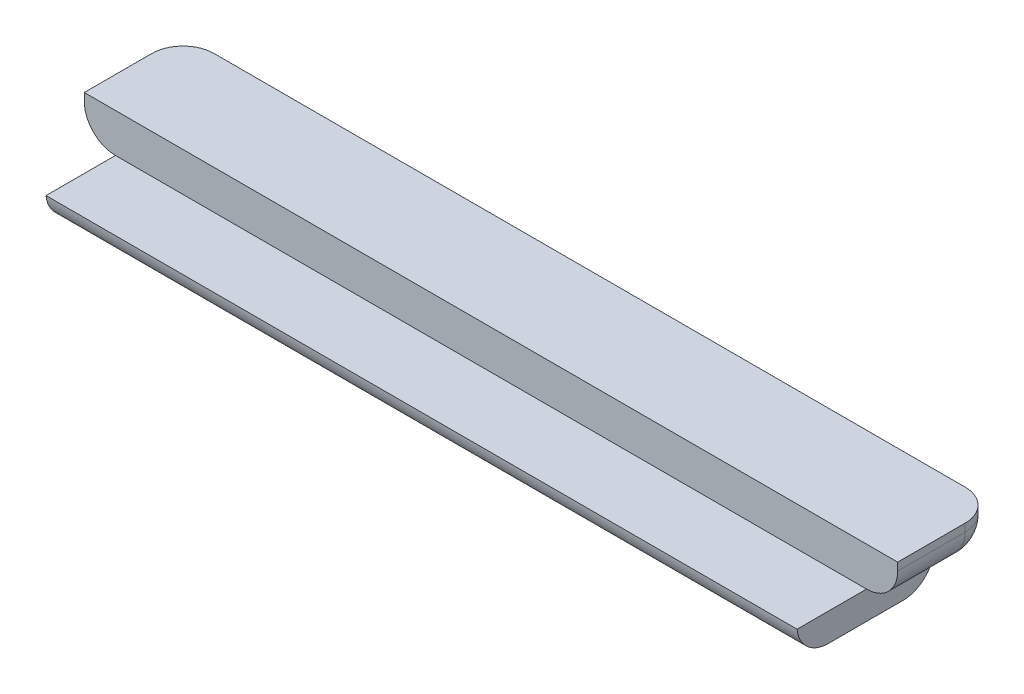
ISO-10303-21;
HEADER;
FILE_DESCRIPTION(('STEP AP214'),'2;1');
FILE_NAME('part.step','',(''),(''),'','','');
FILE_SCHEMA(('AUTOMOTIVE_DESIGN { 1 0 10303 214 1 1 1 1 }'));
ENDSEC;
DATA;
#1=APPLICATION_CONTEXT('core data for automotive mechanical design processes');
#2=APPLICATION_PROTOCOL_DEFINITION('international standard','automotive_design',2000,#1);
#3=PRODUCT_CONTEXT('',#1,'mechanical');
#4=PRODUCT('Part','Part','',(#3));
#5=PRODUCT_RELATED_PRODUCT_CATEGORY('part','',(#4));
#6=PRODUCT_DEFINITION_FORMATION('','',#4);
#7=PRODUCT_DEFINITION_CONTEXT('part definition',#1,'design');
#8=PRODUCT_DEFINITION('design','',#6,#7);
#9=PRODUCT_DEFINITION_SHAPE('','',#8);
#10=(LENGTH_UNIT() NAMED_UNIT(*) SI_UNIT(.MILLI.,.METRE.));
#11=(NAMED_UNIT(*) PLANE_ANGLE_UNIT() SI_UNIT($,.RADIAN.));
#12=(NAMED_UNIT(*) SI_UNIT($,.STERADIAN.) SOLID_ANGLE_UNIT());
#13=UNCERTAINTY_MEASURE_WITH_UNIT(LENGTH_MEASURE(1.E-05),#10,'distance_accuracy_value','');
#14=(GEOMETRIC_REPRESENTATION_CONTEXT(3) GLOBAL_UNCERTAINTY_ASSIGNED_CONTEXT((#13)) GLOBAL_UNIT_ASSIGNED_CONTEXT((#10,
#11,#12)) REPRESENTATION_CONTEXT('',''));
#15=CARTESIAN_POINT('',(0.,0.,0.));
#16=DIRECTION('',(0.,0.,1.));
#17=DIRECTION('',(1.,0.,0.));
#18=AXIS2_PLACEMENT_3D('',#15,#16,#17);
#19=CARTESIAN_POINT('',(84.197935513334,-35.5,-38.3185461088218));
#20=DIRECTION('',(0.,0.,1.));
#21=DIRECTION('',(1.,0.,0.));
#22=AXIS2_PLACEMENT_3D('',#19,#20,#21);
#23=CYLINDRICAL_SURFACE('',#22,2.);
#24=CARTESIAN_POINT('',(84.197935513334,-35.5,-31.9863937245133));
#25=DIRECTION('',(0.,0.,1.));
#26=DIRECTION('',(1.,0.,0.));
#27=AXIS2_PLACEMENT_3D('',#24,#25,#26);
#28=CIRCLE('',#27,2.);
#29=CARTESIAN_POINT('',(84.1991109932734,-37.4999996545617,-31.9863937245133));
#30=VERTEX_POINT('',#29);
#31=CARTESIAN_POINT('',(86.197935513334,-35.5,-31.9863937245133));
#32=VERTEX_POINT('',#31);
#33=EDGE_CURVE('E187',#30,#32,#28,.T.);
#34=ORIENTED_EDGE('',*,*,#33,.F.);
#35=DIRECTION('',(0.,0.,1.));
#36=VECTOR('',#35,1.);
#37=CARTESIAN_POINT('',(84.1991109932734,-37.5,-36.3185461088218));
#38=LINE('',#37,#36);
#39=CARTESIAN_POINT('',(84.1991109930703,-37.4999996545618,-36.3185461088218));
#40=VERTEX_POINT('',#39);
#41=EDGE_CURVE('E226',#40,#30,#38,.T.);
#42=ORIENTED_EDGE('',*,*,#41,.F.);
#43=CARTESIAN_POINT('',(84.197935513334,-35.5,-36.3185461088218));
#44=DIRECTION('',(0.,0.,-1.));
#45=DIRECTION('',(-1.,0.,0.));
#46=AXIS2_PLACEMENT_3D('',#43,#44,#45);
#47=CIRCLE('',#46,2.);
#48=CARTESIAN_POINT('',(86.197935513334,-35.5,-36.3185461088218));
#49=VERTEX_POINT('',#48);
#50=EDGE_CURVE('E179',#49,#40,#47,.T.);
#51=ORIENTED_EDGE('',*,*,#50,.F.);
#52=DIRECTION('',(0.,0.,-1.));
#53=VECTOR('',#52,1.);
#54=CARTESIAN_POINT('',(86.197935513334,-35.5,-36.3185461088218));
#55=LINE('',#54,#53);
#56=EDGE_CURVE('E153',#32,#49,#55,.T.);
#57=ORIENTED_EDGE('',*,*,#56,.F.);
#58=EDGE_LOOP('',(#34,#42,#51,#57));
#59=FACE_BOUND('',#58,.T.);
#60=ADVANCED_FACE('F35',(#59),#23,.T.);
#61=CARTESIAN_POINT('',(33.9976879154478,-37.5,-38.3185461088218));
#62=DIRECTION('',(-1.,0.,0.));
#63=DIRECTION('',(0.,0.,1.));
#64=AXIS2_PLACEMENT_3D('',#61,#62,#63);
#65=PLANE('',#64);
#66=DIRECTION('',(0.,0.,1.));
#67=VECTOR('',#66,1.);
#68=CARTESIAN_POINT('',(33.9976879154478,-35.,-38.3185461088218));
#69=LINE('',#68,#67);
#70=CARTESIAN_POINT('',(33.9976879154478,-35.,-36.3185461088218));
#71=VERTEX_POINT('',#70);
#72=CARTESIAN_POINT('',(33.9976879154478,-35.,-31.9863937245133));
#73=VERTEX_POINT('',#72);
#74=EDGE_CURVE('E182',#71,#73,#69,.T.);
#75=ORIENTED_EDGE('',*,*,#74,.F.);
#76=DIRECTION('',(0.,1.,0.));
#77=VECTOR('',#76,1.);
#78=CARTESIAN_POINT('',(33.9976879154478,-37.5,-36.3185461088218));
#79=LINE('',#78,#77);
#80=CARTESIAN_POINT('',(33.9976879154478,-35.5,-36.3185461088218));
#81=VERTEX_POINT('',#80);
#82=EDGE_CURVE('E161',#71,#81,#79,.F.);
#83=ORIENTED_EDGE('',*,*,#82,.T.);
#84=DIRECTION('',(0.,0.,1.));
#85=VECTOR('',#84,1.);
#86=CARTESIAN_POINT('',(33.9976879154478,-35.5,-31.9863937245133));
#87=LINE('',#86,#85);
#88=CARTESIAN_POINT('',(33.9976879154478,-35.5,-31.9863937245133));
#89=VERTEX_POINT('',#88);
#90=EDGE_CURVE('E145',#81,#89,#87,.T.);
#91=ORIENTED_EDGE('',*,*,#90,.T.);
#92=DIRECTION('',(0.,1.,0.));
#93=VECTOR('',#92,1.);
#94=CARTESIAN_POINT('',(33.9976879154478,-37.5,-31.9863937245133));
#95=LINE('',#94,#93);
#96=EDGE_CURVE('E206',#89,#73,#95,.T.);
#97=ORIENTED_EDGE('',*,*,#96,.T.);
#98=EDGE_LOOP('',(#75,#83,#91,#97));
#99=FACE_BOUND('',#98,.T.);
#100=ADVANCED_FACE('F254',(#99),#65,.T.);
#101=CARTESIAN_POINT('',(33.9976879154478,-37.5,-38.3185461088218));
#102=DIRECTION('',(0.,0.,-1.));
#103=DIRECTION('',(-1.,0.,0.));
#104=AXIS2_PLACEMENT_3D('',#101,#102,#103);
#105=PLANE('',#104);
#106=DIRECTION('',(-1.,0.,0.));
#107=VECTOR('',#106,1.);
#108=CARTESIAN_POINT('',(33.9976879154478,-35.,-38.3185461088218));
#109=LINE('',#108,#107);
#110=CARTESIAN_POINT('',(84.197935513334,-35.,-38.3185461088218));
#111=VERTEX_POINT('',#110);
#112=CARTESIAN_POINT('',(35.9976879154478,-35.,-38.3185461088218));
#113=VERTEX_POINT('',#112);
#114=EDGE_CURVE('E210',#111,#113,#109,.T.);
#115=ORIENTED_EDGE('',*,*,#114,.F.);
#116=DIRECTION('',(0.,1.,0.));
#117=VECTOR('',#116,1.);
#118=CARTESIAN_POINT('',(84.197935513334,-37.5,-38.3185461088218));
#119=LINE('',#118,#117);
#120=CARTESIAN_POINT('',(84.197935513334,-35.5,-38.3185461088218));
#121=VERTEX_POINT('',#120);
#122=EDGE_CURVE('E136',#111,#121,#119,.F.);
#123=ORIENTED_EDGE('',*,*,#122,.T.);
#124=DIRECTION('',(-1.,0.,0.));
#125=VECTOR('',#124,1.);
#126=CARTESIAN_POINT('',(33.9976879154478,-35.5,-38.3185461088218));
#127=LINE('',#126,#125);
#128=CARTESIAN_POINT('',(35.9976879154478,-35.5,-38.3185461088218));
#129=VERTEX_POINT('',#128);
#130=EDGE_CURVE('E154',#121,#129,#127,.T.);
#131=ORIENTED_EDGE('',*,*,#130,.T.);
#132=DIRECTION('',(0.,1.,0.));
#133=VECTOR('',#132,1.);
#134=CARTESIAN_POINT('',(35.9976879154478,-37.5,-38.3185461088218));
#135=LINE('',#134,#133);
#136=EDGE_CURVE('E193',#129,#113,#135,.T.);
#137=ORIENTED_EDGE('',*,*,#136,.T.);
#138=EDGE_LOOP('',(#115,#123,#131,#137));
#139=FACE_BOUND('',#138,.T.);
#140=ADVANCED_FACE('F262',(#139),#105,.T.);
#141=CARTESIAN_POINT('',(86.197935513334,-37.5,-38.3185461088218));
#142=DIRECTION('',(1.,0.,0.));
#143=DIRECTION('',(0.,0.,-1.));
#144=AXIS2_PLACEMENT_3D('',#141,#142,#143);
#145=PLANE('',#144);
#146=ORIENTED_EDGE('',*,*,#56,.T.);
#147=DIRECTION('',(0.,1.,0.));
#148=VECTOR('',#147,1.);
#149=CARTESIAN_POINT('',(86.197935513334,-37.5,-36.3185461088218));
#150=LINE('',#149,#148);
#151=CARTESIAN_POINT('',(86.197935513334,-35.,-36.3185461088218));
#152=VERTEX_POINT('',#151);
#153=EDGE_CURVE('E200',#49,#152,#150,.T.);
#154=ORIENTED_EDGE('',*,*,#153,.T.);
#155=DIRECTION('',(0.,0.,-1.));
#156=VECTOR('',#155,1.);
#157=CARTESIAN_POINT('',(86.197935513334,-35.,-38.3185461088218));
#158=LINE('',#157,#156);
#159=CARTESIAN_POINT('',(86.197935513334,-35.,-31.9863937245133));
#160=VERTEX_POINT('',#159);
#161=EDGE_CURVE('E213',#160,#152,#158,.T.);
#162=ORIENTED_EDGE('',*,*,#161,.F.);
#163=DIRECTION('',(0.,1.,0.));
#164=VECTOR('',#163,1.);
#165=CARTESIAN_POINT('',(86.197935513334,-37.5,-31.9863937245133));
#166=LINE('',#165,#164);
#167=EDGE_CURVE('E205',#32,#160,#166,.T.);
#168=ORIENTED_EDGE('',*,*,#167,.F.);
#169=EDGE_LOOP('',(#146,#154,#162,#168));
#170=FACE_BOUND('',#169,.T.);
#171=ADVANCED_FACE('F272',(#170),#145,.T.);
#172=CARTESIAN_POINT('',(33.9976879154478,-37.5,-31.9863937245133));
#173=DIRECTION('',(0.,0.,1.));
#174=DIRECTION('',(1.,0.,0.));
#175=AXIS2_PLACEMENT_3D('',#172,#173,#174);
#176=PLANE('',#175);
#177=DIRECTION('',(1.,0.,0.));
#178=VECTOR('',#177,1.);
#179=CARTESIAN_POINT('',(33.9976879154478,-37.5,-31.9863937245133));
#180=LINE('',#179,#178);
#181=CARTESIAN_POINT('',(35.9976879154478,-37.5,-31.9863937245133));
#182=VERTEX_POINT('',#181);
#183=CARTESIAN_POINT('',(84.197935513334,-37.5,-31.9863937245133));
#184=VERTEX_POINT('',#183);
#185=EDGE_CURVE('E208',#182,#184,#180,.T.);
#186=ORIENTED_EDGE('',*,*,#185,.T.);
#187=EDGE_CURVE('E175',#184,#30,#28,.T.);
#188=ORIENTED_EDGE('',*,*,#187,.T.);
#189=ORIENTED_EDGE('',*,*,#33,.T.);
#190=ORIENTED_EDGE('',*,*,#167,.T.);
#191=DIRECTION('',(1.,0.,0.));
#192=VECTOR('',#191,1.);
#193=CARTESIAN_POINT('',(33.9976879154478,-35.,-31.9863937245133));
#194=LINE('',#193,#192);
#195=EDGE_CURVE('E216',#73,#160,#194,.T.);
#196=ORIENTED_EDGE('',*,*,#195,.F.);
#197=ORIENTED_EDGE('',*,*,#96,.F.);
#198=CARTESIAN_POINT('',(35.9976879154478,-35.5,-31.9863937245133));
#199=DIRECTION('',(0.,0.,1.));
#200=DIRECTION('',(1.,0.,0.));
#201=AXIS2_PLACEMENT_3D('',#198,#199,#200);
#202=CIRCLE('',#201,2.);
#203=EDGE_CURVE('E160',#89,#182,#202,.T.);
#204=ORIENTED_EDGE('',*,*,#203,.T.);
#205=EDGE_LOOP('',(#186,#188,#189,#190,#196,#197,#204));
#206=FACE_BOUND('',#205,.T.);
#207=ADVANCED_FACE('F248',(#206),#176,.T.);
#208=CARTESIAN_POINT('',(0.,-35.,0.));
#209=DIRECTION('',(0.,1.,0.));
#210=DIRECTION('',(0.,0.,1.));
#211=AXIS2_PLACEMENT_3D('',#208,#209,#210);
#212=PLANE('',#211);
#213=ORIENTED_EDGE('',*,*,#161,.T.);
#214=CARTESIAN_POINT('',(84.197935513334,-35.,-36.3185461088218));
#215=DIRECTION('',(0.,1.,0.));
#216=DIRECTION('',(0.,0.,1.));
#217=AXIS2_PLACEMENT_3D('',#214,#215,#216);
#218=CIRCLE('',#217,2.);
#219=EDGE_CURVE('E196',#152,#111,#218,.T.);
#220=ORIENTED_EDGE('',*,*,#219,.T.);
#221=ORIENTED_EDGE('',*,*,#114,.T.);
#222=CARTESIAN_POINT('',(35.9976879154478,-35.,-36.3185461088218));
#223=DIRECTION('',(0.,1.,0.));
#224=DIRECTION('',(0.,0.,1.));
#225=AXIS2_PLACEMENT_3D('',#222,#223,#224);
#226=CIRCLE('',#225,2.);
#227=EDGE_CURVE('E198',#113,#71,#226,.T.);
#228=ORIENTED_EDGE('',*,*,#227,.T.);
#229=ORIENTED_EDGE('',*,*,#74,.T.);
#230=ORIENTED_EDGE('',*,*,#195,.T.);
#231=EDGE_LOOP('',(#213,#220,#221,#228,#229,#230));
#232=FACE_BOUND('',#231,.T.);
#233=ADVANCED_FACE('F257',(#232),#212,.T.);
#234=CARTESIAN_POINT('',(33.9976879154478,-35.5,-36.3185461088218));
#235=DIRECTION('',(1.,0.,0.));
#236=DIRECTION('',(0.,0.,-1.));
#237=AXIS2_PLACEMENT_3D('',#234,#235,#236);
#238=CYLINDRICAL_SURFACE('',#237,2.);
#239=ORIENTED_EDGE('',*,*,#130,.F.);
#240=CARTESIAN_POINT('',(84.197935513334,-35.5,-36.3185461088218));
#241=DIRECTION('',(1.,0.,0.));
#242=DIRECTION('',(0.,0.,-1.));
#243=AXIS2_PLACEMENT_3D('',#240,#241,#242);
#244=CIRCLE('',#243,2.);
#245=CARTESIAN_POINT('',(84.197935513334,-37.5,-36.3185461088218));
#246=VERTEX_POINT('',#245);
#247=EDGE_CURVE('E135',#121,#246,#244,.F.);
#248=ORIENTED_EDGE('',*,*,#247,.T.);
#249=DIRECTION('',(-1.,0.,0.));
#250=VECTOR('',#249,1.);
#251=CARTESIAN_POINT('',(86.197935513334,-37.5,-36.3185461088218));
#252=LINE('',#251,#250);
#253=CARTESIAN_POINT('',(35.9976879154478,-37.5,-36.3185461088218));
#254=VERTEX_POINT('',#253);
#255=EDGE_CURVE('E150',#254,#246,#252,.F.);
#256=ORIENTED_EDGE('',*,*,#255,.F.);
#257=CARTESIAN_POINT('',(35.9976879154478,-35.5,-36.3185461088218));
#258=DIRECTION('',(1.,0.,0.));
#259=DIRECTION('',(0.,0.,-1.));
#260=AXIS2_PLACEMENT_3D('',#257,#258,#259);
#261=CIRCLE('',#260,2.);
#262=EDGE_CURVE('E124',#254,#129,#261,.T.);
#263=ORIENTED_EDGE('',*,*,#262,.T.);
#264=EDGE_LOOP('',(#239,#248,#256,#263));
#265=FACE_BOUND('',#264,.T.);
#266=ADVANCED_FACE('F151',(#265),#238,.T.);
#267=CARTESIAN_POINT('',(84.197935513334,-35.5,-36.3185461088218));
#268=DIRECTION('',(1.,0.,0.));
#269=DIRECTION('',(0.,0.,-1.));
#270=AXIS2_PLACEMENT_3D('',#267,#268,#269);
#271=SPHERICAL_SURFACE('',#270,2.);
#272=ORIENTED_EDGE('',*,*,#50,.T.);
#273=DIRECTION('',(1.,0.,0.));
#274=VECTOR('',#273,1.);
#275=CARTESIAN_POINT('',(35.9976879154478,-37.5,-36.3185461088218));
#276=LINE('',#275,#274);
#277=EDGE_CURVE('E230',#246,#40,#276,.T.);
#278=ORIENTED_EDGE('',*,*,#277,.F.);
#279=ORIENTED_EDGE('',*,*,#247,.F.);
#280=CARTESIAN_POINT('',(84.197935513334,-35.5,-36.3185461088218));
#281=DIRECTION('',(0.,1.,0.));
#282=DIRECTION('',(0.,0.,1.));
#283=AXIS2_PLACEMENT_3D('',#280,#281,#282);
#284=CIRCLE('',#283,2.);
#285=EDGE_CURVE('E146',#49,#121,#284,.T.);
#286=ORIENTED_EDGE('',*,*,#285,.F.);
#287=EDGE_LOOP('',(#272,#278,#279,#286));
#288=FACE_BOUND('',#287,.T.);
#289=ADVANCED_FACE('F266',(#288),#271,.T.);
#290=CARTESIAN_POINT('',(84.197935513334,-37.5,-36.3185461088218));
#291=DIRECTION('',(0.,1.,0.));
#292=DIRECTION('',(0.,0.,1.));
#293=AXIS2_PLACEMENT_3D('',#290,#291,#292);
#294=CYLINDRICAL_SURFACE('',#293,2.);
#295=ORIENTED_EDGE('',*,*,#285,.T.);
#296=ORIENTED_EDGE('',*,*,#122,.F.);
#297=ORIENTED_EDGE('',*,*,#219,.F.);
#298=ORIENTED_EDGE('',*,*,#153,.F.);
#299=EDGE_LOOP('',(#295,#296,#297,#298));
#300=FACE_BOUND('',#299,.T.);
#301=ADVANCED_FACE('F269',(#300),#294,.T.);
#302=CARTESIAN_POINT('',(35.9976879154478,-35.5,-38.3185461088218));
#303=DIRECTION('',(0.,0.,-1.));
#304=DIRECTION('',(-1.,0.,0.));
#305=AXIS2_PLACEMENT_3D('',#302,#303,#304);
#306=CYLINDRICAL_SURFACE('',#305,2.);
#307=CARTESIAN_POINT('',(35.9976879154478,-35.5,-36.3185461088218));
#308=DIRECTION('',(0.,0.,-1.));
#309=DIRECTION('',(-1.,0.,0.));
#310=AXIS2_PLACEMENT_3D('',#307,#308,#309);
#311=CIRCLE('',#310,2.);
#312=EDGE_CURVE('E127',#254,#81,#311,.T.);
#313=ORIENTED_EDGE('',*,*,#312,.F.);
#314=DIRECTION('',(0.,0.,1.));
#315=VECTOR('',#314,1.);
#316=CARTESIAN_POINT('',(35.9976879154478,-37.5,-36.3185461088218));
#317=LINE('',#316,#315);
#318=EDGE_CURVE('E143',#182,#254,#317,.F.);
#319=ORIENTED_EDGE('',*,*,#318,.F.);
#320=ORIENTED_EDGE('',*,*,#203,.F.);
#321=ORIENTED_EDGE('',*,*,#90,.F.);
#322=EDGE_LOOP('',(#313,#319,#320,#321));
#323=FACE_BOUND('',#322,.T.);
#324=ADVANCED_FACE('F141',(#323),#306,.T.);
#325=CARTESIAN_POINT('',(35.9976879154478,-35.5,-36.3185461088218));
#326=DIRECTION('',(-1.,0.,0.));
#327=DIRECTION('',(0.,0.,1.));
#328=AXIS2_PLACEMENT_3D('',#325,#326,#327);
#329=SPHERICAL_SURFACE('',#328,2.);
#330=ORIENTED_EDGE('',*,*,#262,.F.);
#331=ORIENTED_EDGE('',*,*,#312,.T.);
#332=CARTESIAN_POINT('',(35.9976879154478,-35.5,-36.3185461088218));
#333=DIRECTION('',(0.,1.,0.));
#334=DIRECTION('',(0.,0.,1.));
#335=AXIS2_PLACEMENT_3D('',#332,#333,#334);
#336=CIRCLE('',#335,2.);
#337=EDGE_CURVE('E129',#129,#81,#336,.T.);
#338=ORIENTED_EDGE('',*,*,#337,.F.);
#339=EDGE_LOOP('',(#330,#331,#338));
#340=FACE_BOUND('',#339,.T.);
#341=ADVANCED_FACE('F126',(#340),#329,.T.);
#342=CARTESIAN_POINT('',(35.9976879154478,-37.5,-36.3185461088218));
#343=DIRECTION('',(0.,1.,0.));
#344=DIRECTION('',(0.,0.,1.));
#345=AXIS2_PLACEMENT_3D('',#342,#343,#344);
#346=CYLINDRICAL_SURFACE('',#345,2.);
#347=ORIENTED_EDGE('',*,*,#337,.T.);
#348=ORIENTED_EDGE('',*,*,#82,.F.);
#349=ORIENTED_EDGE('',*,*,#227,.F.);
#350=ORIENTED_EDGE('',*,*,#136,.F.);
#351=EDGE_LOOP('',(#347,#348,#349,#350));
#352=FACE_BOUND('',#351,.T.);
#353=ADVANCED_FACE('F260',(#352),#346,.T.);
#354=CARTESIAN_POINT('',(0.,-37.5,0.));
#355=DIRECTION('',(0.,1.,0.));
#356=DIRECTION('',(0.,0.,1.));
#357=AXIS2_PLACEMENT_3D('',#354,#355,#356);
#358=PLANE('',#357);
#359=ORIENTED_EDGE('',*,*,#187,.F.);
#360=ORIENTED_EDGE('',*,*,#185,.F.);
#361=DIRECTION('',(0.,0.,-1.));
#362=VECTOR('',#361,1.);
#363=CARTESIAN_POINT('',(35.9976879154478,-37.5,-36.3185461088218));
#364=LINE('',#363,#362);
#365=CARTESIAN_POINT('',(35.9976879154478,-37.5,-27.5295198989113));
#366=VERTEX_POINT('',#365);
#367=EDGE_CURVE('E159',#366,#182,#364,.T.);
#368=ORIENTED_EDGE('',*,*,#367,.F.);
#369=DIRECTION('',(-1.,0.,0.));
#370=VECTOR('',#369,1.);
#371=CARTESIAN_POINT('',(35.9976879154478,-37.5,-27.5295198989113));
#372=LINE('',#371,#370);
#373=CARTESIAN_POINT('',(84.1991109932734,-37.5,-27.5295198989113));
#374=VERTEX_POINT('',#373);
#375=EDGE_CURVE('E222',#374,#366,#372,.T.);
#376=ORIENTED_EDGE('',*,*,#375,.F.);
#377=EDGE_CURVE('E229',#30,#374,#38,.T.);
#378=ORIENTED_EDGE('',*,*,#377,.F.);
#379=EDGE_LOOP('',(#359,#360,#368,#376,#378));
#380=FACE_BOUND('',#379,.T.);
#381=ADVANCED_FACE('F240',(#380),#358,.T.);
#382=CARTESIAN_POINT('',(35.9976879154478,-39.3,-36.3185461088218));
#383=DIRECTION('',(1.,0.,0.));
#384=DIRECTION('',(0.,0.,-1.));
#385=AXIS2_PLACEMENT_3D('',#382,#383,#384);
#386=PLANE('',#385);
#387=ORIENTED_EDGE('',*,*,#318,.T.);
#388=CARTESIAN_POINT('',(35.9976879154478,-37.3,-34.3285712346085));
#389=DIRECTION('',(1.,0.,0.));
#390=DIRECTION('',(0.,0.,-1.));
#391=AXIS2_PLACEMENT_3D('',#388,#389,#390);
#392=CIRCLE('',#391,2.);
#393=CARTESIAN_POINT('',(35.9976879154478,-39.3,-34.3285712346085));
#394=VERTEX_POINT('',#393);
#395=EDGE_CURVE('E11',#254,#394,#392,.F.);
#396=ORIENTED_EDGE('',*,*,#395,.T.);
#397=DIRECTION('',(0.,0.,-1.));
#398=VECTOR('',#397,1.);
#399=CARTESIAN_POINT('',(35.9976879154478,-39.3,-36.3185461088218));
#400=LINE('',#399,#398);
#401=CARTESIAN_POINT('',(35.9976879154478,-39.3,-29.5194947731245));
#402=VERTEX_POINT('',#401);
#403=EDGE_CURVE('E225',#402,#394,#400,.T.);
#404=ORIENTED_EDGE('',*,*,#403,.F.);
#405=CARTESIAN_POINT('',(35.9976879154478,-37.3,-29.5194947731245));
#406=DIRECTION('',(1.,0.,0.));
#407=DIRECTION('',(0.,0.,-1.));
#408=AXIS2_PLACEMENT_3D('',#405,#406,#407);
#409=CIRCLE('',#408,2.);
#410=EDGE_CURVE('E169',#402,#366,#409,.F.);
#411=ORIENTED_EDGE('',*,*,#410,.T.);
#412=ORIENTED_EDGE('',*,*,#367,.T.);
#413=EDGE_LOOP('',(#387,#396,#404,#411,#412));
#414=FACE_BOUND('',#413,.T.);
#415=ADVANCED_FACE('F157',(#414),#386,.F.);
#416=CARTESIAN_POINT('',(84.1991109932734,-39.3,-36.3185461088218));
#417=DIRECTION('',(-1.,0.,0.));
#418=DIRECTION('',(0.,0.,1.));
#419=AXIS2_PLACEMENT_3D('',#416,#417,#418);
#420=PLANE('',#419);
#421=DIRECTION('',(0.,0.,1.));
#422=VECTOR('',#421,1.);
#423=CARTESIAN_POINT('',(84.1991109932734,-39.3,-36.3185461088218));
#424=LINE('',#423,#422);
#425=CARTESIAN_POINT('',(84.1991109932734,-39.3,-34.3285712346085));
#426=VERTEX_POINT('',#425);
#427=CARTESIAN_POINT('',(84.1991109932734,-39.3,-29.5194947731245));
#428=VERTEX_POINT('',#427);
#429=EDGE_CURVE('E178',#426,#428,#424,.T.);
#430=ORIENTED_EDGE('',*,*,#429,.F.);
#431=CARTESIAN_POINT('',(84.1991109932734,-37.3,-34.3285712346085));
#432=DIRECTION('',(-1.,0.,0.));
#433=DIRECTION('',(0.,0.,1.));
#434=AXIS2_PLACEMENT_3D('',#431,#432,#433);
#435=CIRCLE('',#434,2.);
#436=EDGE_CURVE('E43',#426,#40,#435,.F.);
#437=ORIENTED_EDGE('',*,*,#436,.T.);
#438=ORIENTED_EDGE('',*,*,#41,.T.);
#439=ORIENTED_EDGE('',*,*,#377,.T.);
#440=CARTESIAN_POINT('',(84.1991109932734,-37.3,-29.5194947731245));
#441=DIRECTION('',(-1.,0.,0.));
#442=DIRECTION('',(0.,0.,1.));
#443=AXIS2_PLACEMENT_3D('',#440,#441,#442);
#444=CIRCLE('',#443,2.);
#445=EDGE_CURVE('E166',#374,#428,#444,.F.);
#446=ORIENTED_EDGE('',*,*,#445,.T.);
#447=EDGE_LOOP('',(#430,#437,#438,#439,#446));
#448=FACE_BOUND('',#447,.T.);
#449=ADVANCED_FACE('F245',(#448),#420,.F.);
#450=CARTESIAN_POINT('',(0.,-39.3,0.));
#451=DIRECTION('',(0.,1.,0.));
#452=DIRECTION('',(0.,0.,1.));
#453=AXIS2_PLACEMENT_3D('',#450,#451,#452);
#454=PLANE('',#453);
#455=ORIENTED_EDGE('',*,*,#403,.T.);
#456=DIRECTION('',(1.,0.,0.));
#457=VECTOR('',#456,1.);
#458=CARTESIAN_POINT('',(0.,-39.3,-34.3285712346085));
#459=LINE('',#458,#457);
#460=EDGE_CURVE('E163',#394,#426,#459,.T.);
#461=ORIENTED_EDGE('',*,*,#460,.T.);
#462=ORIENTED_EDGE('',*,*,#429,.T.);
#463=DIRECTION('',(1.,0.,0.));
#464=VECTOR('',#463,1.);
#465=CARTESIAN_POINT('',(0.,-39.3,-29.5194947731245));
#466=LINE('',#465,#464);
#467=EDGE_CURVE('E173',#428,#402,#466,.F.);
#468=ORIENTED_EDGE('',*,*,#467,.T.);
#469=EDGE_LOOP('',(#455,#461,#462,#468));
#470=FACE_BOUND('',#469,.T.);
#471=ADVANCED_FACE('F234',(#470),#454,.F.);
#472=CARTESIAN_POINT('',(35.9976879154478,-37.3,-29.5194947731245));
#473=DIRECTION('',(1.,0.,0.));
#474=DIRECTION('',(0.,0.,-1.));
#475=AXIS2_PLACEMENT_3D('',#472,#473,#474);
#476=CYLINDRICAL_SURFACE('',#475,2.);
#477=ORIENTED_EDGE('',*,*,#445,.F.);
#478=ORIENTED_EDGE('',*,*,#375,.T.);
#479=ORIENTED_EDGE('',*,*,#410,.F.);
#480=ORIENTED_EDGE('',*,*,#467,.F.);
#481=EDGE_LOOP('',(#477,#478,#479,#480));
#482=FACE_BOUND('',#481,.T.);
#483=ADVANCED_FACE('F243',(#482),#476,.T.);
#484=CARTESIAN_POINT('',(33.9976879154478,-37.3,-34.3285712346085));
#485=DIRECTION('',(1.,0.,0.));
#486=DIRECTION('',(0.,0.,-1.));
#487=AXIS2_PLACEMENT_3D('',#484,#485,#486);
#488=CYLINDRICAL_SURFACE('',#487,2.);
#489=ORIENTED_EDGE('',*,*,#255,.T.);
#490=ORIENTED_EDGE('',*,*,#277,.T.);
#491=ORIENTED_EDGE('',*,*,#436,.F.);
#492=ORIENTED_EDGE('',*,*,#460,.F.);
#493=ORIENTED_EDGE('',*,*,#395,.F.);
#494=EDGE_LOOP('',(#489,#490,#491,#492,#493));
#495=FACE_BOUND('',#494,.T.);
#496=ADVANCED_FACE('F37',(#495),#488,.T.);
#497=CLOSED_SHELL('',(#60,#100,#140,#171,#207,#233,#266,#289,#301,#324,#341,#353,#381,#415,#449,
#471,#483,#496));
#498=MANIFOLD_SOLID_BREP('B2',#497);
#499=ADVANCED_BREP_SHAPE_REPRESENTATION('',(#18,#498),#14);
#500=SHAPE_DEFINITION_REPRESENTATION(#9,#499);
ENDSEC;
END-ISO-10303-21;
